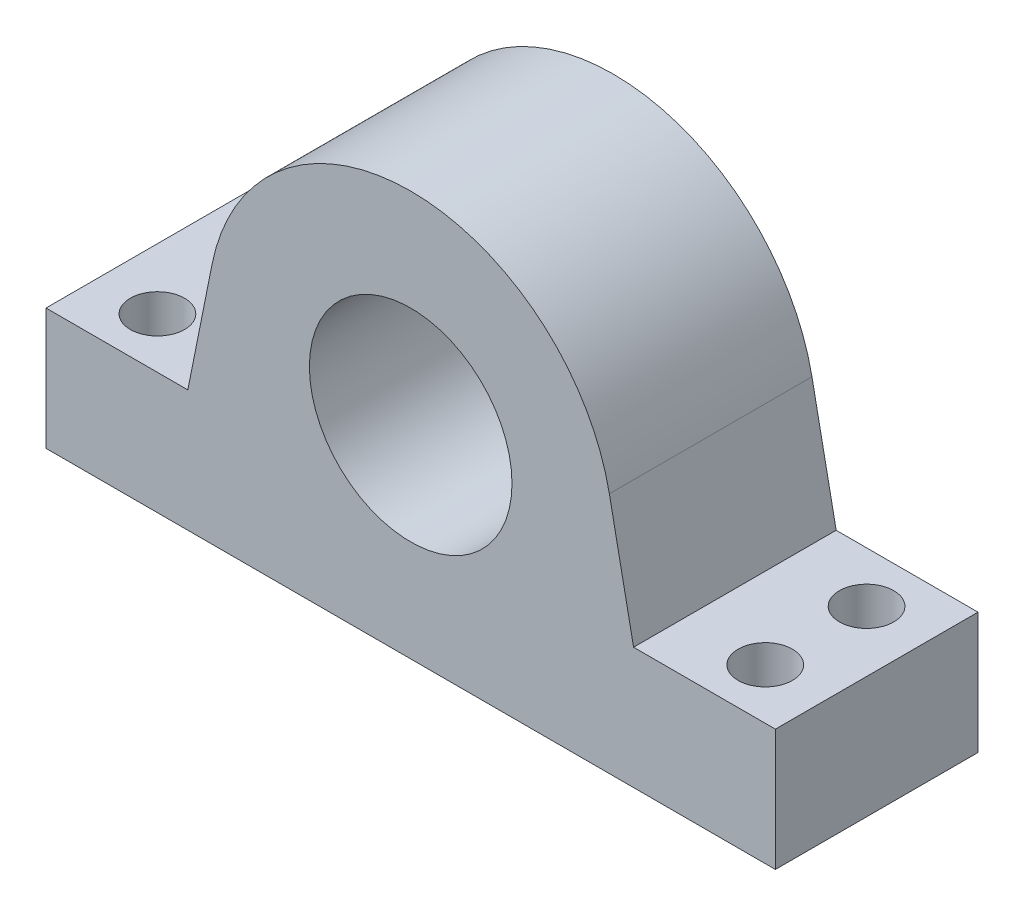
ISO-10303-21;
HEADER;
FILE_DESCRIPTION(('STEP AP214'),'2;1');
FILE_NAME('part.step','',(''),(''),'','','');
FILE_SCHEMA(('AUTOMOTIVE_DESIGN { 1 0 10303 214 1 1 1 1 }'));
ENDSEC;
DATA;
#1=APPLICATION_CONTEXT('core data for automotive mechanical design processes');
#2=APPLICATION_PROTOCOL_DEFINITION('international standard','automotive_design',2000,#1);
#3=PRODUCT_CONTEXT('',#1,'mechanical');
#4=PRODUCT('Part','Part','',(#3));
#5=PRODUCT_RELATED_PRODUCT_CATEGORY('part','',(#4));
#6=PRODUCT_DEFINITION_FORMATION('','',#4);
#7=PRODUCT_DEFINITION_CONTEXT('part definition',#1,'design');
#8=PRODUCT_DEFINITION('design','',#6,#7);
#9=PRODUCT_DEFINITION_SHAPE('','',#8);
#10=(LENGTH_UNIT() NAMED_UNIT(*) SI_UNIT(.MILLI.,.METRE.));
#11=(NAMED_UNIT(*) PLANE_ANGLE_UNIT() SI_UNIT($,.RADIAN.));
#12=(NAMED_UNIT(*) SI_UNIT($,.STERADIAN.) SOLID_ANGLE_UNIT());
#13=UNCERTAINTY_MEASURE_WITH_UNIT(LENGTH_MEASURE(1.E-05),#10,'distance_accuracy_value','');
#14=(GEOMETRIC_REPRESENTATION_CONTEXT(3) GLOBAL_UNCERTAINTY_ASSIGNED_CONTEXT((#13)) GLOBAL_UNIT_ASSIGNED_CONTEXT((#10,
#11,#12)) REPRESENTATION_CONTEXT('',''));
#15=CARTESIAN_POINT('',(0.,0.,0.));
#16=DIRECTION('',(0.,0.,1.));
#17=DIRECTION('',(1.,0.,0.));
#18=AXIS2_PLACEMENT_3D('',#15,#16,#17);
#19=CARTESIAN_POINT('',(0.,0.,6.35));
#20=DIRECTION('',(0.,0.,1.));
#21=DIRECTION('',(1.,0.,0.));
#22=AXIS2_PLACEMENT_3D('',#19,#20,#21);
#23=PLANE('',#22);
#24=CARTESIAN_POINT('',(0.,0.,6.35));
#25=DIRECTION('',(0.,0.,1.));
#26=DIRECTION('',(1.,0.,0.));
#27=AXIS2_PLACEMENT_3D('',#24,#25,#26);
#28=CIRCLE('',#27,12.7);
#29=CARTESIAN_POINT('',(12.452586398096,2.49461259476395,6.35));
#30=VERTEX_POINT('',#29);
#31=CARTESIAN_POINT('',(-12.452586398096,2.49461259476395,6.35));
#32=VERTEX_POINT('',#31);
#33=EDGE_CURVE('E145',#30,#32,#28,.T.);
#34=ORIENTED_EDGE('',*,*,#33,.T.);
#35=DIRECTION('',(-0.196426188564091,-0.980518614023306,0.));
#36=VECTOR('',#35,1.);
#37=CARTESIAN_POINT('',(-12.452586398096,2.49461259476395,6.35));
#38=LINE('',#37,#36);
#39=CARTESIAN_POINT('',(-13.97,-5.08,6.35));
#40=VERTEX_POINT('',#39);
#41=EDGE_CURVE('E93',#32,#40,#38,.T.);
#42=ORIENTED_EDGE('',*,*,#41,.T.);
#43=DIRECTION('',(-1.,0.,0.));
#44=VECTOR('',#43,1.);
#45=CARTESIAN_POINT('',(-13.97,-5.08,6.35));
#46=LINE('',#45,#44);
#47=CARTESIAN_POINT('',(-22.86,-5.08,6.35));
#48=VERTEX_POINT('',#47);
#49=EDGE_CURVE('E160',#40,#48,#46,.T.);
#50=ORIENTED_EDGE('',*,*,#49,.T.);
#51=DIRECTION('',(0.,-1.,0.));
#52=VECTOR('',#51,1.);
#53=CARTESIAN_POINT('',(-22.86,-5.08,6.35));
#54=LINE('',#53,#52);
#55=CARTESIAN_POINT('',(-22.86,-12.7,6.35));
#56=VERTEX_POINT('',#55);
#57=EDGE_CURVE('E173',#48,#56,#54,.T.);
#58=ORIENTED_EDGE('',*,*,#57,.T.);
#59=DIRECTION('',(1.,0.,0.));
#60=VECTOR('',#59,1.);
#61=CARTESIAN_POINT('',(-22.86,-12.7,6.35));
#62=LINE('',#61,#60);
#63=CARTESIAN_POINT('',(22.86,-12.7,6.35));
#64=VERTEX_POINT('',#63);
#65=EDGE_CURVE('E112',#56,#64,#62,.T.);
#66=ORIENTED_EDGE('',*,*,#65,.T.);
#67=DIRECTION('',(0.,1.,0.));
#68=VECTOR('',#67,1.);
#69=CARTESIAN_POINT('',(22.86,-12.7,6.35));
#70=LINE('',#69,#68);
#71=CARTESIAN_POINT('',(22.86,-5.08,6.35));
#72=VERTEX_POINT('',#71);
#73=EDGE_CURVE('E106',#64,#72,#70,.T.);
#74=ORIENTED_EDGE('',*,*,#73,.T.);
#75=DIRECTION('',(-1.,0.,0.));
#76=VECTOR('',#75,1.);
#77=CARTESIAN_POINT('',(22.86,-5.08,6.35));
#78=LINE('',#77,#76);
#79=CARTESIAN_POINT('',(13.97,-5.08,6.35));
#80=VERTEX_POINT('',#79);
#81=EDGE_CURVE('E110',#72,#80,#78,.T.);
#82=ORIENTED_EDGE('',*,*,#81,.T.);
#83=DIRECTION('',(-0.19642618856409,0.980518614023306,0.));
#84=VECTOR('',#83,1.);
#85=CARTESIAN_POINT('',(12.452586398096,2.49461259476395,6.35));
#86=LINE('',#85,#84);
#87=EDGE_CURVE('E50',#80,#30,#86,.T.);
#88=ORIENTED_EDGE('',*,*,#87,.T.);
#89=EDGE_LOOP('',(#34,#42,#50,#58,#66,#74,#82,#88));
#90=FACE_BOUND('',#89,.T.);
#91=CARTESIAN_POINT('',(0.,0.,6.35));
#92=DIRECTION('',(0.,0.,1.));
#93=DIRECTION('',(1.,0.,0.));
#94=AXIS2_PLACEMENT_3D('',#91,#92,#93);
#95=CIRCLE('',#94,6.35);
#96=CARTESIAN_POINT('',(6.35,0.,6.35));
#97=VERTEX_POINT('',#96);
#98=EDGE_CURVE('E134',#97,#97,#95,.T.);
#99=ORIENTED_EDGE('',*,*,#98,.F.);
#100=EDGE_LOOP('',(#99));
#101=FACE_BOUND('',#100,.T.);
#102=ADVANCED_FACE('F33',(#90,#101),#23,.T.);
#103=CARTESIAN_POINT('',(0.,0.,-6.35));
#104=DIRECTION('',(0.,0.,1.));
#105=DIRECTION('',(1.,0.,0.));
#106=AXIS2_PLACEMENT_3D('',#103,#104,#105);
#107=PLANE('',#106);
#108=CARTESIAN_POINT('',(0.,0.,-6.35));
#109=DIRECTION('',(0.,0.,1.));
#110=DIRECTION('',(1.,0.,0.));
#111=AXIS2_PLACEMENT_3D('',#108,#109,#110);
#112=CIRCLE('',#111,12.7);
#113=CARTESIAN_POINT('',(12.452586398096,2.49461259476395,-6.35));
#114=VERTEX_POINT('',#113);
#115=CARTESIAN_POINT('',(-12.452586398096,2.49461259476395,-6.35));
#116=VERTEX_POINT('',#115);
#117=EDGE_CURVE('E130',#114,#116,#112,.T.);
#118=ORIENTED_EDGE('',*,*,#117,.F.);
#119=DIRECTION('',(-0.19642618856409,0.980518614023306,0.));
#120=VECTOR('',#119,1.);
#121=CARTESIAN_POINT('',(12.452586398096,2.49461259476395,-6.35));
#122=LINE('',#121,#120);
#123=CARTESIAN_POINT('',(13.97,-5.08,-6.35));
#124=VERTEX_POINT('',#123);
#125=EDGE_CURVE('E85',#124,#114,#122,.T.);
#126=ORIENTED_EDGE('',*,*,#125,.F.);
#127=DIRECTION('',(-1.,0.,0.));
#128=VECTOR('',#127,1.);
#129=CARTESIAN_POINT('',(22.86,-5.08,-6.35));
#130=LINE('',#129,#128);
#131=CARTESIAN_POINT('',(22.86,-5.08,-6.35));
#132=VERTEX_POINT('',#131);
#133=EDGE_CURVE('E79',#132,#124,#130,.T.);
#134=ORIENTED_EDGE('',*,*,#133,.F.);
#135=DIRECTION('',(0.,1.,0.));
#136=VECTOR('',#135,1.);
#137=CARTESIAN_POINT('',(22.86,-12.7,-6.35));
#138=LINE('',#137,#136);
#139=CARTESIAN_POINT('',(22.86,-12.7,-6.35));
#140=VERTEX_POINT('',#139);
#141=EDGE_CURVE('E120',#140,#132,#138,.T.);
#142=ORIENTED_EDGE('',*,*,#141,.F.);
#143=DIRECTION('',(1.,0.,0.));
#144=VECTOR('',#143,1.);
#145=CARTESIAN_POINT('',(-22.86,-12.7,-6.35));
#146=LINE('',#145,#144);
#147=CARTESIAN_POINT('',(-22.86,-12.7,-6.35));
#148=VERTEX_POINT('',#147);
#149=EDGE_CURVE('E140',#148,#140,#146,.T.);
#150=ORIENTED_EDGE('',*,*,#149,.F.);
#151=DIRECTION('',(0.,-1.,0.));
#152=VECTOR('',#151,1.);
#153=CARTESIAN_POINT('',(-22.86,-5.08,-6.35));
#154=LINE('',#153,#152);
#155=CARTESIAN_POINT('',(-22.86,-5.08,-6.35));
#156=VERTEX_POINT('',#155);
#157=EDGE_CURVE('E138',#156,#148,#154,.T.);
#158=ORIENTED_EDGE('',*,*,#157,.F.);
#159=DIRECTION('',(-1.,0.,0.));
#160=VECTOR('',#159,1.);
#161=CARTESIAN_POINT('',(-13.97,-5.08,-6.35));
#162=LINE('',#161,#160);
#163=CARTESIAN_POINT('',(-13.97,-5.08,-6.35));
#164=VERTEX_POINT('',#163);
#165=EDGE_CURVE('E136',#164,#156,#162,.T.);
#166=ORIENTED_EDGE('',*,*,#165,.F.);
#167=DIRECTION('',(-0.196426188564091,-0.980518614023306,0.));
#168=VECTOR('',#167,1.);
#169=CARTESIAN_POINT('',(-12.452586398096,2.49461259476395,-6.35));
#170=LINE('',#169,#168);
#171=EDGE_CURVE('E133',#116,#164,#170,.T.);
#172=ORIENTED_EDGE('',*,*,#171,.F.);
#173=EDGE_LOOP('',(#118,#126,#134,#142,#150,#158,#166,#172));
#174=FACE_BOUND('',#173,.T.);
#175=CARTESIAN_POINT('',(0.,0.,-6.35));
#176=DIRECTION('',(0.,0.,1.));
#177=DIRECTION('',(1.,0.,0.));
#178=AXIS2_PLACEMENT_3D('',#175,#176,#177);
#179=CIRCLE('',#178,6.35);
#180=CARTESIAN_POINT('',(6.35,0.,-6.35));
#181=VERTEX_POINT('',#180);
#182=EDGE_CURVE('E179',#181,#181,#179,.T.);
#183=ORIENTED_EDGE('',*,*,#182,.T.);
#184=EDGE_LOOP('',(#183));
#185=FACE_BOUND('',#184,.T.);
#186=ADVANCED_FACE('F164',(#174,#185),#107,.F.);
#187=CARTESIAN_POINT('',(0.,0.,6.35));
#188=DIRECTION('',(0.,0.,-1.));
#189=DIRECTION('',(-1.,0.,0.));
#190=AXIS2_PLACEMENT_3D('',#187,#188,#189);
#191=CYLINDRICAL_SURFACE('',#190,12.7);
#192=ORIENTED_EDGE('',*,*,#117,.T.);
#193=DIRECTION('',(0.,0.,-1.));
#194=VECTOR('',#193,1.);
#195=CARTESIAN_POINT('',(-12.452586398096,2.49461259476395,6.35));
#196=LINE('',#195,#194);
#197=EDGE_CURVE('E11',#32,#116,#196,.T.);
#198=ORIENTED_EDGE('',*,*,#197,.F.);
#199=ORIENTED_EDGE('',*,*,#33,.F.);
#200=DIRECTION('',(0.,0.,-1.));
#201=VECTOR('',#200,1.);
#202=CARTESIAN_POINT('',(12.452586398096,2.49461259476395,6.35));
#203=LINE('',#202,#201);
#204=EDGE_CURVE('E126',#30,#114,#203,.T.);
#205=ORIENTED_EDGE('',*,*,#204,.T.);
#206=EDGE_LOOP('',(#192,#198,#199,#205));
#207=FACE_BOUND('',#206,.T.);
#208=ADVANCED_FACE('F35',(#207),#191,.T.);
#209=CARTESIAN_POINT('',(-12.452586398096,2.49461259476395,6.35));
#210=DIRECTION('',(0.980518614023306,-0.196426188564091,0.));
#211=DIRECTION('',(0.196426188564091,0.980518614023306,0.));
#212=AXIS2_PLACEMENT_3D('',#209,#210,#211);
#213=PLANE('',#212);
#214=ORIENTED_EDGE('',*,*,#171,.T.);
#215=DIRECTION('',(0.,0.,-1.));
#216=VECTOR('',#215,1.);
#217=CARTESIAN_POINT('',(-13.97,-5.08,6.35));
#218=LINE('',#217,#216);
#219=EDGE_CURVE('E42',#40,#164,#218,.T.);
#220=ORIENTED_EDGE('',*,*,#219,.F.);
#221=ORIENTED_EDGE('',*,*,#41,.F.);
#222=ORIENTED_EDGE('',*,*,#197,.T.);
#223=EDGE_LOOP('',(#214,#220,#221,#222));
#224=FACE_BOUND('',#223,.T.);
#225=ADVANCED_FACE('F253',(#224),#213,.F.);
#226=CARTESIAN_POINT('',(-13.97,-5.08,6.35));
#227=DIRECTION('',(0.,-1.,0.));
#228=DIRECTION('',(0.,0.,-1.));
#229=AXIS2_PLACEMENT_3D('',#226,#227,#228);
#230=PLANE('',#229);
#231=CARTESIAN_POINT('',(-19.05,-5.08,3.175));
#232=DIRECTION('',(0.,-1.,0.));
#233=DIRECTION('',(0.,0.,-1.));
#234=AXIS2_PLACEMENT_3D('',#231,#232,#233);
#235=CIRCLE('',#234,1.7018);
#236=CARTESIAN_POINT('',(-19.05,-5.08,4.8768));
#237=VERTEX_POINT('',#236);
#238=EDGE_CURVE('E191',#237,#237,#235,.T.);
#239=ORIENTED_EDGE('',*,*,#238,.T.);
#240=EDGE_LOOP('',(#239));
#241=FACE_BOUND('',#240,.T.);
#242=CARTESIAN_POINT('',(-19.05,-5.08,-3.175));
#243=DIRECTION('',(0.,1.,0.));
#244=DIRECTION('',(0.,0.,1.));
#245=AXIS2_PLACEMENT_3D('',#242,#243,#244);
#246=CIRCLE('',#245,1.7018);
#247=CARTESIAN_POINT('',(-19.05,-5.08,-1.4732));
#248=VERTEX_POINT('',#247);
#249=EDGE_CURVE('E185',#248,#248,#246,.T.);
#250=ORIENTED_EDGE('',*,*,#249,.F.);
#251=EDGE_LOOP('',(#250));
#252=FACE_BOUND('',#251,.T.);
#253=ORIENTED_EDGE('',*,*,#165,.T.);
#254=DIRECTION('',(0.,0.,-1.));
#255=VECTOR('',#254,1.);
#256=CARTESIAN_POINT('',(-22.86,-5.08,6.35));
#257=LINE('',#256,#255);
#258=EDGE_CURVE('E152',#48,#156,#257,.T.);
#259=ORIENTED_EDGE('',*,*,#258,.F.);
#260=ORIENTED_EDGE('',*,*,#49,.F.);
#261=ORIENTED_EDGE('',*,*,#219,.T.);
#262=EDGE_LOOP('',(#253,#259,#260,#261));
#263=FACE_BOUND('',#262,.T.);
#264=ADVANCED_FACE('F158',(#241,#252,#263),#230,.F.);
#265=CARTESIAN_POINT('',(-22.86,-5.08,6.35));
#266=DIRECTION('',(1.,0.,0.));
#267=DIRECTION('',(0.,0.,-1.));
#268=AXIS2_PLACEMENT_3D('',#265,#266,#267);
#269=PLANE('',#268);
#270=ORIENTED_EDGE('',*,*,#157,.T.);
#271=DIRECTION('',(0.,0.,-1.));
#272=VECTOR('',#271,1.);
#273=CARTESIAN_POINT('',(-22.86,-12.7,6.35));
#274=LINE('',#273,#272);
#275=EDGE_CURVE('E149',#56,#148,#274,.T.);
#276=ORIENTED_EDGE('',*,*,#275,.F.);
#277=ORIENTED_EDGE('',*,*,#57,.F.);
#278=ORIENTED_EDGE('',*,*,#258,.T.);
#279=EDGE_LOOP('',(#270,#276,#277,#278));
#280=FACE_BOUND('',#279,.T.);
#281=ADVANCED_FACE('F169',(#280),#269,.F.);
#282=CARTESIAN_POINT('',(-22.86,-12.7,6.35));
#283=DIRECTION('',(0.,1.,0.));
#284=DIRECTION('',(0.,0.,1.));
#285=AXIS2_PLACEMENT_3D('',#282,#283,#284);
#286=PLANE('',#285);
#287=CARTESIAN_POINT('',(19.05,-12.7,3.175));
#288=DIRECTION('',(0.,1.,0.));
#289=DIRECTION('',(0.,0.,-1.));
#290=AXIS2_PLACEMENT_3D('',#287,#288,#289);
#291=CIRCLE('',#290,1.7018);
#292=CARTESIAN_POINT('',(19.05,-12.7,4.8768));
#293=VERTEX_POINT('',#292);
#294=EDGE_CURVE('E200',#293,#293,#291,.T.);
#295=ORIENTED_EDGE('',*,*,#294,.T.);
#296=EDGE_LOOP('',(#295));
#297=FACE_BOUND('',#296,.T.);
#298=CARTESIAN_POINT('',(19.05,-12.7,-3.175));
#299=DIRECTION('',(0.,-1.,0.));
#300=DIRECTION('',(0.,0.,1.));
#301=AXIS2_PLACEMENT_3D('',#298,#299,#300);
#302=CIRCLE('',#301,1.7018);
#303=CARTESIAN_POINT('',(19.05,-12.7,-1.4732));
#304=VERTEX_POINT('',#303);
#305=EDGE_CURVE('E194',#304,#304,#302,.T.);
#306=ORIENTED_EDGE('',*,*,#305,.F.);
#307=EDGE_LOOP('',(#306));
#308=FACE_BOUND('',#307,.T.);
#309=CARTESIAN_POINT('',(-19.05,-12.7,3.175));
#310=DIRECTION('',(0.,-1.,0.));
#311=DIRECTION('',(0.,0.,-1.));
#312=AXIS2_PLACEMENT_3D('',#309,#310,#311);
#313=CIRCLE('',#312,1.7018);
#314=CARTESIAN_POINT('',(-19.05,-12.7,4.8768));
#315=VERTEX_POINT('',#314);
#316=EDGE_CURVE('E188',#315,#315,#313,.T.);
#317=ORIENTED_EDGE('',*,*,#316,.F.);
#318=EDGE_LOOP('',(#317));
#319=FACE_BOUND('',#318,.T.);
#320=CARTESIAN_POINT('',(-19.05,-12.7,-3.175));
#321=DIRECTION('',(0.,1.,0.));
#322=DIRECTION('',(0.,0.,1.));
#323=AXIS2_PLACEMENT_3D('',#320,#321,#322);
#324=CIRCLE('',#323,1.7018);
#325=CARTESIAN_POINT('',(-19.05,-12.7,-1.4732));
#326=VERTEX_POINT('',#325);
#327=EDGE_CURVE('E182',#326,#326,#324,.T.);
#328=ORIENTED_EDGE('',*,*,#327,.T.);
#329=EDGE_LOOP('',(#328));
#330=FACE_BOUND('',#329,.T.);
#331=ORIENTED_EDGE('',*,*,#149,.T.);
#332=DIRECTION('',(0.,0.,-1.));
#333=VECTOR('',#332,1.);
#334=CARTESIAN_POINT('',(22.86,-12.7,6.35));
#335=LINE('',#334,#333);
#336=EDGE_CURVE('E121',#64,#140,#335,.T.);
#337=ORIENTED_EDGE('',*,*,#336,.F.);
#338=ORIENTED_EDGE('',*,*,#65,.F.);
#339=ORIENTED_EDGE('',*,*,#275,.T.);
#340=EDGE_LOOP('',(#331,#337,#338,#339));
#341=FACE_BOUND('',#340,.T.);
#342=ADVANCED_FACE('F172',(#297,#308,#319,#330,#341),#286,.F.);
#343=CARTESIAN_POINT('',(22.86,-12.7,6.35));
#344=DIRECTION('',(-1.,0.,0.));
#345=DIRECTION('',(0.,0.,1.));
#346=AXIS2_PLACEMENT_3D('',#343,#344,#345);
#347=PLANE('',#346);
#348=ORIENTED_EDGE('',*,*,#141,.T.);
#349=DIRECTION('',(0.,0.,-1.));
#350=VECTOR('',#349,1.);
#351=CARTESIAN_POINT('',(22.86,-5.08,6.35));
#352=LINE('',#351,#350);
#353=EDGE_CURVE('E117',#72,#132,#352,.T.);
#354=ORIENTED_EDGE('',*,*,#353,.F.);
#355=ORIENTED_EDGE('',*,*,#73,.F.);
#356=ORIENTED_EDGE('',*,*,#336,.T.);
#357=EDGE_LOOP('',(#348,#354,#355,#356));
#358=FACE_BOUND('',#357,.T.);
#359=ADVANCED_FACE('F118',(#358),#347,.F.);
#360=CARTESIAN_POINT('',(22.86,-5.08,6.35));
#361=DIRECTION('',(0.,-1.,0.));
#362=DIRECTION('',(0.,0.,-1.));
#363=AXIS2_PLACEMENT_3D('',#360,#361,#362);
#364=PLANE('',#363);
#365=CARTESIAN_POINT('',(19.05,-5.08,3.175));
#366=DIRECTION('',(0.,1.,0.));
#367=DIRECTION('',(0.,0.,-1.));
#368=AXIS2_PLACEMENT_3D('',#365,#366,#367);
#369=CIRCLE('',#368,1.7018);
#370=CARTESIAN_POINT('',(19.05,-5.08,4.8768));
#371=VERTEX_POINT('',#370);
#372=EDGE_CURVE('E203',#371,#371,#369,.T.);
#373=ORIENTED_EDGE('',*,*,#372,.F.);
#374=EDGE_LOOP('',(#373));
#375=FACE_BOUND('',#374,.T.);
#376=CARTESIAN_POINT('',(19.05,-5.08,-3.175));
#377=DIRECTION('',(0.,-1.,0.));
#378=DIRECTION('',(0.,0.,1.));
#379=AXIS2_PLACEMENT_3D('',#376,#377,#378);
#380=CIRCLE('',#379,1.7018);
#381=CARTESIAN_POINT('',(19.05,-5.08,-1.4732));
#382=VERTEX_POINT('',#381);
#383=EDGE_CURVE('E197',#382,#382,#380,.T.);
#384=ORIENTED_EDGE('',*,*,#383,.T.);
#385=EDGE_LOOP('',(#384));
#386=FACE_BOUND('',#385,.T.);
#387=ORIENTED_EDGE('',*,*,#133,.T.);
#388=DIRECTION('',(0.,0.,-1.));
#389=VECTOR('',#388,1.);
#390=CARTESIAN_POINT('',(13.97,-5.08,6.35));
#391=LINE('',#390,#389);
#392=EDGE_CURVE('E122',#80,#124,#391,.T.);
#393=ORIENTED_EDGE('',*,*,#392,.F.);
#394=ORIENTED_EDGE('',*,*,#81,.F.);
#395=ORIENTED_EDGE('',*,*,#353,.T.);
#396=EDGE_LOOP('',(#387,#393,#394,#395));
#397=FACE_BOUND('',#396,.T.);
#398=ADVANCED_FACE('F124',(#375,#386,#397),#364,.F.);
#399=CARTESIAN_POINT('',(12.452586398096,2.49461259476395,6.35));
#400=DIRECTION('',(-0.980518614023306,-0.19642618856409,0.));
#401=DIRECTION('',(0.19642618856409,-0.980518614023306,0.));
#402=AXIS2_PLACEMENT_3D('',#399,#400,#401);
#403=PLANE('',#402);
#404=ORIENTED_EDGE('',*,*,#125,.T.);
#405=ORIENTED_EDGE('',*,*,#204,.F.);
#406=ORIENTED_EDGE('',*,*,#87,.F.);
#407=ORIENTED_EDGE('',*,*,#392,.T.);
#408=EDGE_LOOP('',(#404,#405,#406,#407));
#409=FACE_BOUND('',#408,.T.);
#410=ADVANCED_FACE('F220',(#409),#403,.F.);
#411=CARTESIAN_POINT('',(0.,0.,6.35));
#412=DIRECTION('',(0.,0.,-1.));
#413=DIRECTION('',(-1.,0.,0.));
#414=AXIS2_PLACEMENT_3D('',#411,#412,#413);
#415=CYLINDRICAL_SURFACE('',#414,6.35);
#416=ORIENTED_EDGE('',*,*,#98,.T.);
#417=EDGE_LOOP('',(#416));
#418=FACE_BOUND('',#417,.T.);
#419=ORIENTED_EDGE('',*,*,#182,.F.);
#420=EDGE_LOOP('',(#419));
#421=FACE_BOUND('',#420,.T.);
#422=ADVANCED_FACE('F241',(#418,#421),#415,.F.);
#423=CARTESIAN_POINT('',(-19.05,-12.7,-3.175));
#424=DIRECTION('',(0.,1.,0.));
#425=DIRECTION('',(0.,0.,1.));
#426=AXIS2_PLACEMENT_3D('',#423,#424,#425);
#427=CYLINDRICAL_SURFACE('',#426,1.7018);
#428=CARTESIAN_POINT('',(-19.05,-12.7,-1.4732));
#429=CARTESIAN_POINT('',(-19.05,-12.620625,-1.4732));
#430=CARTESIAN_POINT('',(-19.05,-12.54125,-1.4732));
#431=CARTESIAN_POINT('',(-19.05,-12.3825,-1.4732));
#432=CARTESIAN_POINT('',(-19.05,-12.303125,-1.4732));
#433=CARTESIAN_POINT('',(-19.05,-12.144375,-1.4732));
#434=CARTESIAN_POINT('',(-19.05,-12.065,-1.4732));
#435=CARTESIAN_POINT('',(-19.05,-11.90625,-1.4732));
#436=CARTESIAN_POINT('',(-19.05,-11.826875,-1.4732));
#437=CARTESIAN_POINT('',(-19.05,-11.668125,-1.4732));
#438=CARTESIAN_POINT('',(-19.05,-11.58875,-1.4732));
#439=CARTESIAN_POINT('',(-19.05,-11.43,-1.4732));
#440=CARTESIAN_POINT('',(-19.05,-11.350625,-1.4732));
#441=CARTESIAN_POINT('',(-19.05,-11.191875,-1.4732));
#442=CARTESIAN_POINT('',(-19.05,-11.1125,-1.4732));
#443=CARTESIAN_POINT('',(-19.05,-10.95375,-1.4732));
#444=CARTESIAN_POINT('',(-19.05,-10.874375,-1.4732));
#445=CARTESIAN_POINT('',(-19.05,-10.715625,-1.4732));
#446=CARTESIAN_POINT('',(-19.05,-10.63625,-1.4732));
#447=CARTESIAN_POINT('',(-19.05,-10.4775,-1.4732));
#448=CARTESIAN_POINT('',(-19.05,-10.398125,-1.4732));
#449=CARTESIAN_POINT('',(-19.05,-10.239375,-1.4732));
#450=CARTESIAN_POINT('',(-19.05,-10.16,-1.4732));
#451=CARTESIAN_POINT('',(-19.05,-10.00125,-1.4732));
#452=CARTESIAN_POINT('',(-19.05,-9.921875,-1.4732));
#453=CARTESIAN_POINT('',(-19.05,-9.763125,-1.4732));
#454=CARTESIAN_POINT('',(-19.05,-9.68375,-1.4732));
#455=CARTESIAN_POINT('',(-19.05,-9.525,-1.4732));
#456=CARTESIAN_POINT('',(-19.05,-9.445625,-1.4732));
#457=CARTESIAN_POINT('',(-19.05,-9.286875,-1.4732));
#458=CARTESIAN_POINT('',(-19.05,-9.2075,-1.4732));
#459=CARTESIAN_POINT('',(-19.05,-9.04875,-1.4732));
#460=CARTESIAN_POINT('',(-19.05,-8.969375,-1.4732));
#461=CARTESIAN_POINT('',(-19.05,-8.810625,-1.4732));
#462=CARTESIAN_POINT('',(-19.05,-8.73125,-1.4732));
#463=CARTESIAN_POINT('',(-19.05,-8.5725,-1.4732));
#464=CARTESIAN_POINT('',(-19.05,-8.493125,-1.4732));
#465=CARTESIAN_POINT('',(-19.05,-8.334375,-1.4732));
#466=CARTESIAN_POINT('',(-19.05,-8.255,-1.4732));
#467=CARTESIAN_POINT('',(-19.05,-8.09625,-1.4732));
#468=CARTESIAN_POINT('',(-19.05,-8.016875,-1.4732));
#469=CARTESIAN_POINT('',(-19.05,-7.858125,-1.4732));
#470=CARTESIAN_POINT('',(-19.05,-7.77875,-1.4732));
#471=CARTESIAN_POINT('',(-19.05,-7.62,-1.4732));
#472=CARTESIAN_POINT('',(-19.05,-7.540625,-1.4732));
#473=CARTESIAN_POINT('',(-19.05,-7.381875,-1.4732));
#474=CARTESIAN_POINT('',(-19.05,-7.3025,-1.4732));
#475=CARTESIAN_POINT('',(-19.05,-7.14375,-1.4732));
#476=CARTESIAN_POINT('',(-19.05,-7.064375,-1.4732));
#477=CARTESIAN_POINT('',(-19.05,-6.905625,-1.4732));
#478=CARTESIAN_POINT('',(-19.05,-6.82625,-1.4732));
#479=CARTESIAN_POINT('',(-19.05,-6.6675,-1.4732));
#480=CARTESIAN_POINT('',(-19.05,-6.588125,-1.4732));
#481=CARTESIAN_POINT('',(-19.05,-6.429375,-1.4732));
#482=CARTESIAN_POINT('',(-19.05,-6.35,-1.4732));
#483=CARTESIAN_POINT('',(-19.05,-6.19125,-1.4732));
#484=CARTESIAN_POINT('',(-19.05,-6.111875,-1.4732));
#485=CARTESIAN_POINT('',(-19.05,-5.953125,-1.4732));
#486=CARTESIAN_POINT('',(-19.05,-5.87375,-1.4732));
#487=CARTESIAN_POINT('',(-19.05,-5.715,-1.4732));
#488=CARTESIAN_POINT('',(-19.05,-5.635625,-1.4732));
#489=CARTESIAN_POINT('',(-19.05,-5.476875,-1.4732));
#490=CARTESIAN_POINT('',(-19.05,-5.3975,-1.4732));
#491=CARTESIAN_POINT('',(-19.05,-5.23875,-1.4732));
#492=CARTESIAN_POINT('',(-19.05,-5.159375,-1.4732));
#493=CARTESIAN_POINT('',(-19.05,-5.08,-1.4732));
#494=B_SPLINE_CURVE_WITH_KNOTS('',3,(#428,#429,#430,#431,#432,#433,#434,#435,#436,#437,#438,
#439,#440,#441,#442,#443,#444,#445,#446,#447,#448,#449,#450,#451,#452,#453,#454,#455,#456,#457,
#458,#459,#460,#461,#462,#463,#464,#465,#466,#467,#468,#469,#470,#471,#472,#473,#474,#475,#476,
#477,#478,#479,#480,#481,#482,#483,#484,#485,#486,#487,#488,#489,#490,#491,#492,#493),
.UNSPECIFIED.,.F.,.F.,(4,2,2,2,2,2,2,2,2,2,2,2,2,2,2,2,2,2,2,2,2,2,2,2,2,2,2,2,2,2,2,2,4),(0.,
0.238124999999999,0.476249999999999,0.714375,0.952499999999998,1.190625,1.42875,1.666875,1.905,
2.143125,2.38125,2.619375,2.8575,3.095625,3.33375,3.571875,3.81,4.048125,4.28625,4.524375,
4.7625,5.000625,5.23875,5.476875,5.715,5.953125,6.19125,6.429375,6.6675,6.905625,7.14375,
7.381875,7.62),.UNSPECIFIED.);
#495=EDGE_CURVE('BSEAM231',#326,#248,#494,.T.);
#496=ORIENTED_EDGE('',*,*,#327,.F.);
#497=ORIENTED_EDGE('',*,*,#249,.T.);
#498=ORIENTED_EDGE('',*,*,#495,.T.);
#499=ORIENTED_EDGE('',*,*,#495,.F.);
#500=EDGE_LOOP('',(#496,#498,#497,#499));
#501=FACE_BOUND('',#500,.T.);
#502=ADVANCED_FACE('F231',(#501),#427,.F.);
#503=CARTESIAN_POINT('',(-19.05,-12.7,3.175));
#504=DIRECTION('',(0.,1.,0.));
#505=DIRECTION('',(0.,0.,1.));
#506=AXIS2_PLACEMENT_3D('',#503,#504,#505);
#507=CYLINDRICAL_SURFACE('',#506,1.7018);
#508=CARTESIAN_POINT('',(-19.05,-12.7,4.8768));
#509=CARTESIAN_POINT('',(-19.05,-12.620625,4.8768));
#510=CARTESIAN_POINT('',(-19.05,-12.54125,4.8768));
#511=CARTESIAN_POINT('',(-19.05,-12.3825,4.8768));
#512=CARTESIAN_POINT('',(-19.05,-12.303125,4.8768));
#513=CARTESIAN_POINT('',(-19.05,-12.144375,4.8768));
#514=CARTESIAN_POINT('',(-19.05,-12.065,4.8768));
#515=CARTESIAN_POINT('',(-19.05,-11.90625,4.8768));
#516=CARTESIAN_POINT('',(-19.05,-11.826875,4.8768));
#517=CARTESIAN_POINT('',(-19.05,-11.668125,4.8768));
#518=CARTESIAN_POINT('',(-19.05,-11.58875,4.8768));
#519=CARTESIAN_POINT('',(-19.05,-11.43,4.8768));
#520=CARTESIAN_POINT('',(-19.05,-11.350625,4.8768));
#521=CARTESIAN_POINT('',(-19.05,-11.191875,4.8768));
#522=CARTESIAN_POINT('',(-19.05,-11.1125,4.8768));
#523=CARTESIAN_POINT('',(-19.05,-10.95375,4.8768));
#524=CARTESIAN_POINT('',(-19.05,-10.874375,4.8768));
#525=CARTESIAN_POINT('',(-19.05,-10.715625,4.8768));
#526=CARTESIAN_POINT('',(-19.05,-10.63625,4.8768));
#527=CARTESIAN_POINT('',(-19.05,-10.4775,4.8768));
#528=CARTESIAN_POINT('',(-19.05,-10.398125,4.8768));
#529=CARTESIAN_POINT('',(-19.05,-10.239375,4.8768));
#530=CARTESIAN_POINT('',(-19.05,-10.16,4.8768));
#531=CARTESIAN_POINT('',(-19.05,-10.00125,4.8768));
#532=CARTESIAN_POINT('',(-19.05,-9.921875,4.8768));
#533=CARTESIAN_POINT('',(-19.05,-9.763125,4.8768));
#534=CARTESIAN_POINT('',(-19.05,-9.68375,4.8768));
#535=CARTESIAN_POINT('',(-19.05,-9.525,4.8768));
#536=CARTESIAN_POINT('',(-19.05,-9.445625,4.8768));
#537=CARTESIAN_POINT('',(-19.05,-9.286875,4.8768));
#538=CARTESIAN_POINT('',(-19.05,-9.2075,4.8768));
#539=CARTESIAN_POINT('',(-19.05,-9.04875,4.8768));
#540=CARTESIAN_POINT('',(-19.05,-8.969375,4.8768));
#541=CARTESIAN_POINT('',(-19.05,-8.810625,4.8768));
#542=CARTESIAN_POINT('',(-19.05,-8.73125,4.8768));
#543=CARTESIAN_POINT('',(-19.05,-8.5725,4.8768));
#544=CARTESIAN_POINT('',(-19.05,-8.493125,4.8768));
#545=CARTESIAN_POINT('',(-19.05,-8.334375,4.8768));
#546=CARTESIAN_POINT('',(-19.05,-8.255,4.8768));
#547=CARTESIAN_POINT('',(-19.05,-8.09625,4.8768));
#548=CARTESIAN_POINT('',(-19.05,-8.016875,4.8768));
#549=CARTESIAN_POINT('',(-19.05,-7.858125,4.8768));
#550=CARTESIAN_POINT('',(-19.05,-7.77875,4.8768));
#551=CARTESIAN_POINT('',(-19.05,-7.62,4.8768));
#552=CARTESIAN_POINT('',(-19.05,-7.540625,4.8768));
#553=CARTESIAN_POINT('',(-19.05,-7.381875,4.8768));
#554=CARTESIAN_POINT('',(-19.05,-7.3025,4.8768));
#555=CARTESIAN_POINT('',(-19.05,-7.14375,4.8768));
#556=CARTESIAN_POINT('',(-19.05,-7.064375,4.8768));
#557=CARTESIAN_POINT('',(-19.05,-6.905625,4.8768));
#558=CARTESIAN_POINT('',(-19.05,-6.82625,4.8768));
#559=CARTESIAN_POINT('',(-19.05,-6.6675,4.8768));
#560=CARTESIAN_POINT('',(-19.05,-6.588125,4.8768));
#561=CARTESIAN_POINT('',(-19.05,-6.429375,4.8768));
#562=CARTESIAN_POINT('',(-19.05,-6.35,4.8768));
#563=CARTESIAN_POINT('',(-19.05,-6.19125,4.8768));
#564=CARTESIAN_POINT('',(-19.05,-6.111875,4.8768));
#565=CARTESIAN_POINT('',(-19.05,-5.953125,4.8768));
#566=CARTESIAN_POINT('',(-19.05,-5.87375,4.8768));
#567=CARTESIAN_POINT('',(-19.05,-5.715,4.8768));
#568=CARTESIAN_POINT('',(-19.05,-5.635625,4.8768));
#569=CARTESIAN_POINT('',(-19.05,-5.476875,4.8768));
#570=CARTESIAN_POINT('',(-19.05,-5.3975,4.8768));
#571=CARTESIAN_POINT('',(-19.05,-5.23875,4.8768));
#572=CARTESIAN_POINT('',(-19.05,-5.159375,4.8768));
#573=CARTESIAN_POINT('',(-19.05,-5.08,4.8768));
#574=B_SPLINE_CURVE_WITH_KNOTS('',3,(#508,#509,#510,#511,#512,#513,#514,#515,#516,#517,#518,
#519,#520,#521,#522,#523,#524,#525,#526,#527,#528,#529,#530,#531,#532,#533,#534,#535,#536,#537,
#538,#539,#540,#541,#542,#543,#544,#545,#546,#547,#548,#549,#550,#551,#552,#553,#554,#555,#556,
#557,#558,#559,#560,#561,#562,#563,#564,#565,#566,#567,#568,#569,#570,#571,#572,#573),
.UNSPECIFIED.,.F.,.F.,(4,2,2,2,2,2,2,2,2,2,2,2,2,2,2,2,2,2,2,2,2,2,2,2,2,2,2,2,2,2,2,2,4),(0.,
0.238125,0.476250000000001,0.714375000000001,0.9525,1.190625,1.42875,1.666875,1.905,2.143125,
2.38125,2.619375,2.8575,3.095625,3.33375,3.571875,3.81,4.048125,4.28625,4.524375,4.7625,
5.000625,5.23875,5.476875,5.715,5.953125,6.19125,6.429375,6.6675,6.905625,7.14375,7.381875,
7.62),.UNSPECIFIED.);
#575=EDGE_CURVE('BSEAM225',#315,#237,#574,.T.);
#576=ORIENTED_EDGE('',*,*,#316,.T.);
#577=ORIENTED_EDGE('',*,*,#238,.F.);
#578=ORIENTED_EDGE('',*,*,#575,.T.);
#579=ORIENTED_EDGE('',*,*,#575,.F.);
#580=EDGE_LOOP('',(#576,#578,#577,#579));
#581=FACE_BOUND('',#580,.T.);
#582=ADVANCED_FACE('F225',(#581),#507,.F.);
#583=CARTESIAN_POINT('',(19.05,-12.7,-3.175));
#584=DIRECTION('',(0.,1.,0.));
#585=DIRECTION('',(0.,0.,1.));
#586=AXIS2_PLACEMENT_3D('',#583,#584,#585);
#587=CYLINDRICAL_SURFACE('',#586,1.7018);
#588=CARTESIAN_POINT('',(19.05,-12.7,-1.4732));
#589=CARTESIAN_POINT('',(19.05,-12.620625,-1.4732));
#590=CARTESIAN_POINT('',(19.05,-12.54125,-1.4732));
#591=CARTESIAN_POINT('',(19.05,-12.3825,-1.4732));
#592=CARTESIAN_POINT('',(19.05,-12.303125,-1.4732));
#593=CARTESIAN_POINT('',(19.05,-12.144375,-1.4732));
#594=CARTESIAN_POINT('',(19.05,-12.065,-1.4732));
#595=CARTESIAN_POINT('',(19.05,-11.90625,-1.4732));
#596=CARTESIAN_POINT('',(19.05,-11.826875,-1.4732));
#597=CARTESIAN_POINT('',(19.05,-11.668125,-1.4732));
#598=CARTESIAN_POINT('',(19.05,-11.58875,-1.4732));
#599=CARTESIAN_POINT('',(19.05,-11.43,-1.4732));
#600=CARTESIAN_POINT('',(19.05,-11.350625,-1.4732));
#601=CARTESIAN_POINT('',(19.05,-11.191875,-1.4732));
#602=CARTESIAN_POINT('',(19.05,-11.1125,-1.4732));
#603=CARTESIAN_POINT('',(19.05,-10.95375,-1.4732));
#604=CARTESIAN_POINT('',(19.05,-10.874375,-1.4732));
#605=CARTESIAN_POINT('',(19.05,-10.715625,-1.4732));
#606=CARTESIAN_POINT('',(19.05,-10.63625,-1.4732));
#607=CARTESIAN_POINT('',(19.05,-10.4775,-1.4732));
#608=CARTESIAN_POINT('',(19.05,-10.398125,-1.4732));
#609=CARTESIAN_POINT('',(19.05,-10.239375,-1.4732));
#610=CARTESIAN_POINT('',(19.05,-10.16,-1.4732));
#611=CARTESIAN_POINT('',(19.05,-10.00125,-1.4732));
#612=CARTESIAN_POINT('',(19.05,-9.921875,-1.4732));
#613=CARTESIAN_POINT('',(19.05,-9.763125,-1.4732));
#614=CARTESIAN_POINT('',(19.05,-9.68375,-1.4732));
#615=CARTESIAN_POINT('',(19.05,-9.525,-1.4732));
#616=CARTESIAN_POINT('',(19.05,-9.445625,-1.4732));
#617=CARTESIAN_POINT('',(19.05,-9.286875,-1.4732));
#618=CARTESIAN_POINT('',(19.05,-9.2075,-1.4732));
#619=CARTESIAN_POINT('',(19.05,-9.04875,-1.4732));
#620=CARTESIAN_POINT('',(19.05,-8.969375,-1.4732));
#621=CARTESIAN_POINT('',(19.05,-8.810625,-1.4732));
#622=CARTESIAN_POINT('',(19.05,-8.73125,-1.4732));
#623=CARTESIAN_POINT('',(19.05,-8.5725,-1.4732));
#624=CARTESIAN_POINT('',(19.05,-8.493125,-1.4732));
#625=CARTESIAN_POINT('',(19.05,-8.334375,-1.4732));
#626=CARTESIAN_POINT('',(19.05,-8.255,-1.4732));
#627=CARTESIAN_POINT('',(19.05,-8.09625,-1.4732));
#628=CARTESIAN_POINT('',(19.05,-8.016875,-1.4732));
#629=CARTESIAN_POINT('',(19.05,-7.858125,-1.4732));
#630=CARTESIAN_POINT('',(19.05,-7.77875,-1.4732));
#631=CARTESIAN_POINT('',(19.05,-7.62,-1.4732));
#632=CARTESIAN_POINT('',(19.05,-7.540625,-1.4732));
#633=CARTESIAN_POINT('',(19.05,-7.381875,-1.4732));
#634=CARTESIAN_POINT('',(19.05,-7.3025,-1.4732));
#635=CARTESIAN_POINT('',(19.05,-7.14375,-1.4732));
#636=CARTESIAN_POINT('',(19.05,-7.064375,-1.4732));
#637=CARTESIAN_POINT('',(19.05,-6.905625,-1.4732));
#638=CARTESIAN_POINT('',(19.05,-6.82625,-1.4732));
#639=CARTESIAN_POINT('',(19.05,-6.6675,-1.4732));
#640=CARTESIAN_POINT('',(19.05,-6.588125,-1.4732));
#641=CARTESIAN_POINT('',(19.05,-6.429375,-1.4732));
#642=CARTESIAN_POINT('',(19.05,-6.35,-1.4732));
#643=CARTESIAN_POINT('',(19.05,-6.19125,-1.4732));
#644=CARTESIAN_POINT('',(19.05,-6.111875,-1.4732));
#645=CARTESIAN_POINT('',(19.05,-5.953125,-1.4732));
#646=CARTESIAN_POINT('',(19.05,-5.87375,-1.4732));
#647=CARTESIAN_POINT('',(19.05,-5.715,-1.4732));
#648=CARTESIAN_POINT('',(19.05,-5.635625,-1.4732));
#649=CARTESIAN_POINT('',(19.05,-5.476875,-1.4732));
#650=CARTESIAN_POINT('',(19.05,-5.3975,-1.4732));
#651=CARTESIAN_POINT('',(19.05,-5.23875,-1.4732));
#652=CARTESIAN_POINT('',(19.05,-5.159375,-1.4732));
#653=CARTESIAN_POINT('',(19.05,-5.08,-1.4732));
#654=B_SPLINE_CURVE_WITH_KNOTS('',3,(#588,#589,#590,#591,#592,#593,#594,#595,#596,#597,#598,
#599,#600,#601,#602,#603,#604,#605,#606,#607,#608,#609,#610,#611,#612,#613,#614,#615,#616,#617,
#618,#619,#620,#621,#622,#623,#624,#625,#626,#627,#628,#629,#630,#631,#632,#633,#634,#635,#636,
#637,#638,#639,#640,#641,#642,#643,#644,#645,#646,#647,#648,#649,#650,#651,#652,#653),
.UNSPECIFIED.,.F.,.F.,(4,2,2,2,2,2,2,2,2,2,2,2,2,2,2,2,2,2,2,2,2,2,2,2,2,2,2,2,2,2,2,2,4),(0.,
0.238125,0.476250000000001,0.714375000000001,0.9525,1.190625,1.42875,1.666875,1.905,2.143125,
2.38125,2.619375,2.8575,3.095625,3.33375,3.571875,3.81,4.048125,4.28625,4.524375,4.7625,
5.000625,5.23875,5.476875,5.715,5.953125,6.19125,6.429375,6.6675,6.905625,7.14375,7.381875,
7.62),.UNSPECIFIED.);
#655=EDGE_CURVE('BSEAM214',#304,#382,#654,.T.);
#656=ORIENTED_EDGE('',*,*,#305,.T.);
#657=ORIENTED_EDGE('',*,*,#383,.F.);
#658=ORIENTED_EDGE('',*,*,#655,.T.);
#659=ORIENTED_EDGE('',*,*,#655,.F.);
#660=EDGE_LOOP('',(#656,#658,#657,#659));
#661=FACE_BOUND('',#660,.T.);
#662=ADVANCED_FACE('F214',(#661),#587,.F.);
#663=CARTESIAN_POINT('',(19.05,-12.7,3.175));
#664=DIRECTION('',(0.,1.,0.));
#665=DIRECTION('',(0.,0.,1.));
#666=AXIS2_PLACEMENT_3D('',#663,#664,#665);
#667=CYLINDRICAL_SURFACE('',#666,1.7018);
#668=CARTESIAN_POINT('',(19.05,-12.7,4.8768));
#669=CARTESIAN_POINT('',(19.05,-12.620625,4.8768));
#670=CARTESIAN_POINT('',(19.05,-12.54125,4.8768));
#671=CARTESIAN_POINT('',(19.05,-12.3825,4.8768));
#672=CARTESIAN_POINT('',(19.05,-12.303125,4.8768));
#673=CARTESIAN_POINT('',(19.05,-12.144375,4.8768));
#674=CARTESIAN_POINT('',(19.05,-12.065,4.8768));
#675=CARTESIAN_POINT('',(19.05,-11.90625,4.8768));
#676=CARTESIAN_POINT('',(19.05,-11.826875,4.8768));
#677=CARTESIAN_POINT('',(19.05,-11.668125,4.8768));
#678=CARTESIAN_POINT('',(19.05,-11.58875,4.8768));
#679=CARTESIAN_POINT('',(19.05,-11.43,4.8768));
#680=CARTESIAN_POINT('',(19.05,-11.350625,4.8768));
#681=CARTESIAN_POINT('',(19.05,-11.191875,4.8768));
#682=CARTESIAN_POINT('',(19.05,-11.1125,4.8768));
#683=CARTESIAN_POINT('',(19.05,-10.95375,4.8768));
#684=CARTESIAN_POINT('',(19.05,-10.874375,4.8768));
#685=CARTESIAN_POINT('',(19.05,-10.715625,4.8768));
#686=CARTESIAN_POINT('',(19.05,-10.63625,4.8768));
#687=CARTESIAN_POINT('',(19.05,-10.4775,4.8768));
#688=CARTESIAN_POINT('',(19.05,-10.398125,4.8768));
#689=CARTESIAN_POINT('',(19.05,-10.239375,4.8768));
#690=CARTESIAN_POINT('',(19.05,-10.16,4.8768));
#691=CARTESIAN_POINT('',(19.05,-10.00125,4.8768));
#692=CARTESIAN_POINT('',(19.05,-9.921875,4.8768));
#693=CARTESIAN_POINT('',(19.05,-9.763125,4.8768));
#694=CARTESIAN_POINT('',(19.05,-9.68375,4.8768));
#695=CARTESIAN_POINT('',(19.05,-9.525,4.8768));
#696=CARTESIAN_POINT('',(19.05,-9.445625,4.8768));
#697=CARTESIAN_POINT('',(19.05,-9.286875,4.8768));
#698=CARTESIAN_POINT('',(19.05,-9.2075,4.8768));
#699=CARTESIAN_POINT('',(19.05,-9.04875,4.8768));
#700=CARTESIAN_POINT('',(19.05,-8.969375,4.8768));
#701=CARTESIAN_POINT('',(19.05,-8.810625,4.8768));
#702=CARTESIAN_POINT('',(19.05,-8.73125,4.8768));
#703=CARTESIAN_POINT('',(19.05,-8.5725,4.8768));
#704=CARTESIAN_POINT('',(19.05,-8.493125,4.8768));
#705=CARTESIAN_POINT('',(19.05,-8.334375,4.8768));
#706=CARTESIAN_POINT('',(19.05,-8.255,4.8768));
#707=CARTESIAN_POINT('',(19.05,-8.09625,4.8768));
#708=CARTESIAN_POINT('',(19.05,-8.016875,4.8768));
#709=CARTESIAN_POINT('',(19.05,-7.858125,4.8768));
#710=CARTESIAN_POINT('',(19.05,-7.77875,4.8768));
#711=CARTESIAN_POINT('',(19.05,-7.62,4.8768));
#712=CARTESIAN_POINT('',(19.05,-7.540625,4.8768));
#713=CARTESIAN_POINT('',(19.05,-7.381875,4.8768));
#714=CARTESIAN_POINT('',(19.05,-7.3025,4.8768));
#715=CARTESIAN_POINT('',(19.05,-7.14375,4.8768));
#716=CARTESIAN_POINT('',(19.05,-7.064375,4.8768));
#717=CARTESIAN_POINT('',(19.05,-6.905625,4.8768));
#718=CARTESIAN_POINT('',(19.05,-6.82625,4.8768));
#719=CARTESIAN_POINT('',(19.05,-6.6675,4.8768));
#720=CARTESIAN_POINT('',(19.05,-6.588125,4.8768));
#721=CARTESIAN_POINT('',(19.05,-6.429375,4.8768));
#722=CARTESIAN_POINT('',(19.05,-6.35,4.8768));
#723=CARTESIAN_POINT('',(19.05,-6.19125,4.8768));
#724=CARTESIAN_POINT('',(19.05,-6.111875,4.8768));
#725=CARTESIAN_POINT('',(19.05,-5.953125,4.8768));
#726=CARTESIAN_POINT('',(19.05,-5.87375,4.8768));
#727=CARTESIAN_POINT('',(19.05,-5.715,4.8768));
#728=CARTESIAN_POINT('',(19.05,-5.635625,4.8768));
#729=CARTESIAN_POINT('',(19.05,-5.476875,4.8768));
#730=CARTESIAN_POINT('',(19.05,-5.3975,4.8768));
#731=CARTESIAN_POINT('',(19.05,-5.23875,4.8768));
#732=CARTESIAN_POINT('',(19.05,-5.159375,4.8768));
#733=CARTESIAN_POINT('',(19.05,-5.08,4.8768));
#734=B_SPLINE_CURVE_WITH_KNOTS('',3,(#668,#669,#670,#671,#672,#673,#674,#675,#676,#677,#678,
#679,#680,#681,#682,#683,#684,#685,#686,#687,#688,#689,#690,#691,#692,#693,#694,#695,#696,#697,
#698,#699,#700,#701,#702,#703,#704,#705,#706,#707,#708,#709,#710,#711,#712,#713,#714,#715,#716,
#717,#718,#719,#720,#721,#722,#723,#724,#725,#726,#727,#728,#729,#730,#731,#732,#733),
.UNSPECIFIED.,.F.,.F.,(4,2,2,2,2,2,2,2,2,2,2,2,2,2,2,2,2,2,2,2,2,2,2,2,2,2,2,2,2,2,2,2,4),(0.,
0.238124999999999,0.476249999999999,0.714375,0.952499999999998,1.190625,1.42875,1.666875,1.905,
2.143125,2.38125,2.619375,2.8575,3.095625,3.33375,3.571875,3.81,4.048125,4.28625,4.524375,
4.7625,5.000625,5.23875,5.476875,5.715,5.953125,6.19125,6.429375,6.6675,6.905625,7.14375,
7.381875,7.62),.UNSPECIFIED.);
#735=EDGE_CURVE('BSEAM211',#293,#371,#734,.T.);
#736=ORIENTED_EDGE('',*,*,#294,.F.);
#737=ORIENTED_EDGE('',*,*,#372,.T.);
#738=ORIENTED_EDGE('',*,*,#735,.T.);
#739=ORIENTED_EDGE('',*,*,#735,.F.);
#740=EDGE_LOOP('',(#736,#738,#737,#739));
#741=FACE_BOUND('',#740,.T.);
#742=ADVANCED_FACE('F211',(#741),#667,.F.);
#743=CLOSED_SHELL('',(#102,#186,#208,#225,#264,#281,#342,#359,#398,#410,#422,#502,#582,#662,#742));
#744=MANIFOLD_SOLID_BREP('B2',#743);
#745=ADVANCED_BREP_SHAPE_REPRESENTATION('',(#18,#744),#14);
#746=SHAPE_DEFINITION_REPRESENTATION(#9,#745);
ENDSEC;
END-ISO-10303-21;
